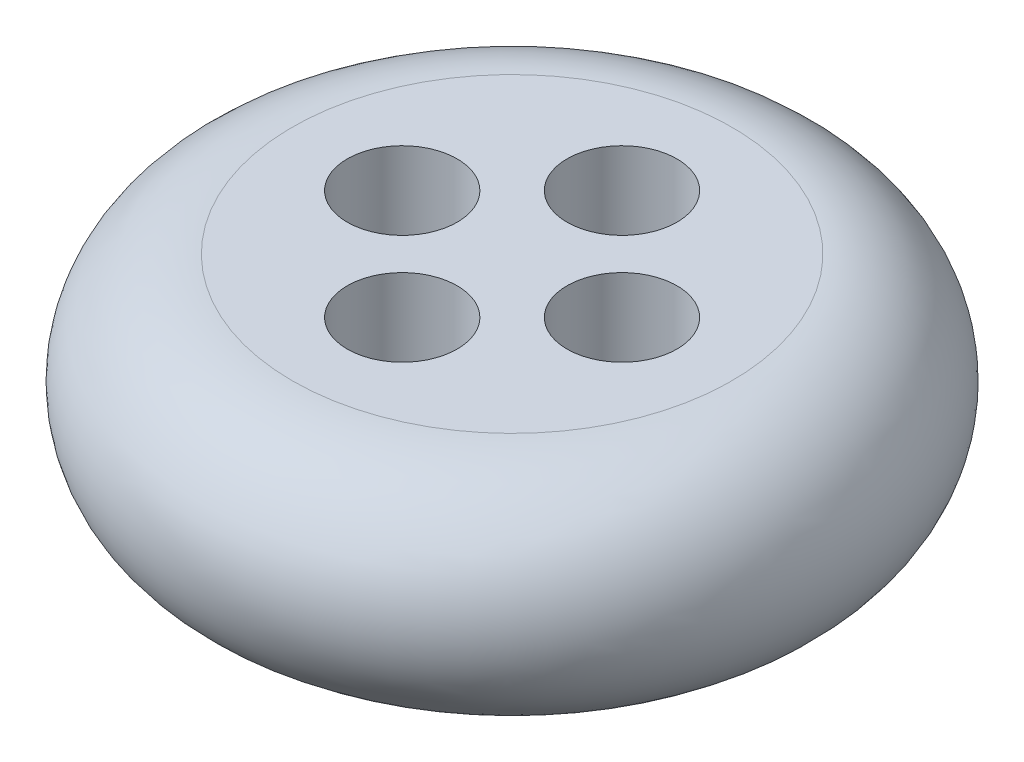
ISO-10303-21;
HEADER;
FILE_DESCRIPTION(('STEP AP214'),'2;1');
FILE_NAME('part.step','',(''),(''),'','','');
FILE_SCHEMA(('AUTOMOTIVE_DESIGN { 1 0 10303 214 1 1 1 1 }'));
ENDSEC;
DATA;
#1=APPLICATION_CONTEXT('core data for automotive mechanical design processes');
#2=APPLICATION_PROTOCOL_DEFINITION('international standard','automotive_design',2000,#1);
#3=PRODUCT_CONTEXT('',#1,'mechanical');
#4=PRODUCT('Part','Part','',(#3));
#5=PRODUCT_RELATED_PRODUCT_CATEGORY('part','',(#4));
#6=PRODUCT_DEFINITION_FORMATION('','',#4);
#7=PRODUCT_DEFINITION_CONTEXT('part definition',#1,'design');
#8=PRODUCT_DEFINITION('design','',#6,#7);
#9=PRODUCT_DEFINITION_SHAPE('','',#8);
#10=(LENGTH_UNIT() NAMED_UNIT(*) SI_UNIT(.MILLI.,.METRE.));
#11=(NAMED_UNIT(*) PLANE_ANGLE_UNIT() SI_UNIT($,.RADIAN.));
#12=(NAMED_UNIT(*) SI_UNIT($,.STERADIAN.) SOLID_ANGLE_UNIT());
#13=UNCERTAINTY_MEASURE_WITH_UNIT(LENGTH_MEASURE(1.E-05),#10,'distance_accuracy_value','');
#14=(GEOMETRIC_REPRESENTATION_CONTEXT(3) GLOBAL_UNCERTAINTY_ASSIGNED_CONTEXT((#13)) GLOBAL_UNIT_ASSIGNED_CONTEXT((#10,
#11,#12)) REPRESENTATION_CONTEXT('',''));
#15=CARTESIAN_POINT('',(0.,0.,0.));
#16=DIRECTION('',(0.,0.,1.));
#17=DIRECTION('',(1.,0.,0.));
#18=AXIS2_PLACEMENT_3D('',#15,#16,#17);
#19=CARTESIAN_POINT('',(0.,5.,0.));
#20=DIRECTION('',(0.,1.,0.));
#21=DIRECTION('',(0.,0.,1.));
#22=AXIS2_PLACEMENT_3D('',#19,#20,#21);
#23=TOROIDAL_SURFACE('',#22,10.,5.);
#24=CARTESIAN_POINT('',(0.,10.,0.));
#25=DIRECTION('',(0.,1.,0.));
#26=DIRECTION('',(0.,0.,1.));
#27=AXIS2_PLACEMENT_3D('',#24,#25,#26);
#28=CIRCLE('',#27,10.);
#29=CARTESIAN_POINT('',(0.,10.,10.));
#30=VERTEX_POINT('',#29);
#31=EDGE_CURVE('E48',#30,#30,#28,.T.);
#32=ORIENTED_EDGE('',*,*,#31,.F.);
#33=EDGE_LOOP('',(#32));
#34=FACE_BOUND('',#33,.T.);
#35=CARTESIAN_POINT('',(0.,0.,0.));
#36=DIRECTION('',(0.,1.,0.));
#37=DIRECTION('',(0.,0.,1.));
#38=AXIS2_PLACEMENT_3D('',#35,#36,#37);
#39=CIRCLE('',#38,10.);
#40=CARTESIAN_POINT('',(0.,0.,10.));
#41=VERTEX_POINT('',#40);
#42=EDGE_CURVE('E10',#41,#41,#39,.F.);
#43=ORIENTED_EDGE('',*,*,#42,.F.);
#44=EDGE_LOOP('',(#43));
#45=FACE_BOUND('',#44,.T.);
#46=ADVANCED_FACE('F41',(#34,#45),#23,.T.);
#47=CARTESIAN_POINT('',(0.,10.,0.));
#48=DIRECTION('',(0.,1.,0.));
#49=DIRECTION('',(0.,0.,1.));
#50=AXIS2_PLACEMENT_3D('',#47,#48,#49);
#51=PLANE('',#50);
#52=ORIENTED_EDGE('',*,*,#31,.T.);
#53=EDGE_LOOP('',(#52));
#54=FACE_BOUND('',#53,.T.);
#55=CARTESIAN_POINT('',(5.,10.,0.));
#56=DIRECTION('',(0.,1.,0.));
#57=DIRECTION('',(0.,0.,1.));
#58=AXIS2_PLACEMENT_3D('',#55,#56,#57);
#59=CIRCLE('',#58,2.5);
#60=CARTESIAN_POINT('',(5.,10.,2.5));
#61=VERTEX_POINT('',#60);
#62=EDGE_CURVE('E65',#61,#61,#59,.T.);
#63=ORIENTED_EDGE('',*,*,#62,.F.);
#64=EDGE_LOOP('',(#63));
#65=FACE_BOUND('',#64,.T.);
#66=CARTESIAN_POINT('',(0.,10.,-5.));
#67=DIRECTION('',(0.,1.,0.));
#68=DIRECTION('',(0.,0.,1.));
#69=AXIS2_PLACEMENT_3D('',#66,#67,#68);
#70=CIRCLE('',#69,2.5);
#71=CARTESIAN_POINT('',(0.,10.,-2.5));
#72=VERTEX_POINT('',#71);
#73=EDGE_CURVE('E52',#72,#72,#70,.T.);
#74=ORIENTED_EDGE('',*,*,#73,.F.);
#75=EDGE_LOOP('',(#74));
#76=FACE_BOUND('',#75,.T.);
#77=CARTESIAN_POINT('',(0.,10.,5.));
#78=DIRECTION('',(0.,1.,0.));
#79=DIRECTION('',(0.,0.,1.));
#80=AXIS2_PLACEMENT_3D('',#77,#78,#79);
#81=CIRCLE('',#80,2.5);
#82=CARTESIAN_POINT('',(0.,10.,7.5));
#83=VERTEX_POINT('',#82);
#84=EDGE_CURVE('E60',#83,#83,#81,.T.);
#85=ORIENTED_EDGE('',*,*,#84,.F.);
#86=EDGE_LOOP('',(#85));
#87=FACE_BOUND('',#86,.T.);
#88=CARTESIAN_POINT('',(-5.,10.,0.));
#89=DIRECTION('',(0.,1.,0.));
#90=DIRECTION('',(0.,0.,1.));
#91=AXIS2_PLACEMENT_3D('',#88,#89,#90);
#92=CIRCLE('',#91,2.5);
#93=CARTESIAN_POINT('',(-5.,10.,2.5));
#94=VERTEX_POINT('',#93);
#95=EDGE_CURVE('E71',#94,#94,#92,.T.);
#96=ORIENTED_EDGE('',*,*,#95,.F.);
#97=EDGE_LOOP('',(#96));
#98=FACE_BOUND('',#97,.T.);
#99=ADVANCED_FACE('F83',(#54,#65,#76,#87,#98),#51,.T.);
#100=CARTESIAN_POINT('',(0.,0.,0.));
#101=DIRECTION('',(0.,1.,0.));
#102=DIRECTION('',(0.,0.,1.));
#103=AXIS2_PLACEMENT_3D('',#100,#101,#102);
#104=PLANE('',#103);
#105=ORIENTED_EDGE('',*,*,#42,.T.);
#106=EDGE_LOOP('',(#105));
#107=FACE_BOUND('',#106,.T.);
#108=CARTESIAN_POINT('',(0.,0.,-5.));
#109=DIRECTION('',(0.,1.,0.));
#110=DIRECTION('',(0.,0.,1.));
#111=AXIS2_PLACEMENT_3D('',#108,#109,#110);
#112=CIRCLE('',#111,2.5);
#113=CARTESIAN_POINT('',(0.,0.,-2.5));
#114=VERTEX_POINT('',#113);
#115=EDGE_CURVE('E56',#114,#114,#112,.T.);
#116=ORIENTED_EDGE('',*,*,#115,.T.);
#117=EDGE_LOOP('',(#116));
#118=FACE_BOUND('',#117,.T.);
#119=CARTESIAN_POINT('',(0.,0.,5.));
#120=DIRECTION('',(0.,1.,0.));
#121=DIRECTION('',(0.,0.,1.));
#122=AXIS2_PLACEMENT_3D('',#119,#120,#121);
#123=CIRCLE('',#122,2.5);
#124=CARTESIAN_POINT('',(0.,0.,7.5));
#125=VERTEX_POINT('',#124);
#126=EDGE_CURVE('E62',#125,#125,#123,.T.);
#127=ORIENTED_EDGE('',*,*,#126,.T.);
#128=EDGE_LOOP('',(#127));
#129=FACE_BOUND('',#128,.T.);
#130=CARTESIAN_POINT('',(5.,0.,0.));
#131=DIRECTION('',(0.,1.,0.));
#132=DIRECTION('',(0.,0.,1.));
#133=AXIS2_PLACEMENT_3D('',#130,#131,#132);
#134=CIRCLE('',#133,2.5);
#135=CARTESIAN_POINT('',(5.,0.,2.5));
#136=VERTEX_POINT('',#135);
#137=EDGE_CURVE('E68',#136,#136,#134,.T.);
#138=ORIENTED_EDGE('',*,*,#137,.T.);
#139=EDGE_LOOP('',(#138));
#140=FACE_BOUND('',#139,.T.);
#141=CARTESIAN_POINT('',(-5.,0.,0.));
#142=DIRECTION('',(0.,1.,0.));
#143=DIRECTION('',(0.,0.,1.));
#144=AXIS2_PLACEMENT_3D('',#141,#142,#143);
#145=CIRCLE('',#144,2.5);
#146=CARTESIAN_POINT('',(-5.,0.,2.5));
#147=VERTEX_POINT('',#146);
#148=EDGE_CURVE('E74',#147,#147,#145,.T.);
#149=ORIENTED_EDGE('',*,*,#148,.T.);
#150=EDGE_LOOP('',(#149));
#151=FACE_BOUND('',#150,.T.);
#152=ADVANCED_FACE('F85',(#107,#118,#129,#140,#151),#104,.F.);
#153=CARTESIAN_POINT('',(0.,10.,-5.));
#154=DIRECTION('',(0.,-1.,0.));
#155=DIRECTION('',(0.,0.,-1.));
#156=AXIS2_PLACEMENT_3D('',#153,#154,#155);
#157=CYLINDRICAL_SURFACE('',#156,2.5);
#158=ORIENTED_EDGE('',*,*,#73,.T.);
#159=EDGE_LOOP('',(#158));
#160=FACE_BOUND('',#159,.T.);
#161=ORIENTED_EDGE('',*,*,#115,.F.);
#162=EDGE_LOOP('',(#161));
#163=FACE_BOUND('',#162,.T.);
#164=ADVANCED_FACE('F91',(#160,#163),#157,.F.);
#165=CARTESIAN_POINT('',(0.,10.,5.));
#166=DIRECTION('',(0.,-1.,0.));
#167=DIRECTION('',(0.,0.,-1.));
#168=AXIS2_PLACEMENT_3D('',#165,#166,#167);
#169=CYLINDRICAL_SURFACE('',#168,2.5);
#170=ORIENTED_EDGE('',*,*,#84,.T.);
#171=EDGE_LOOP('',(#170));
#172=FACE_BOUND('',#171,.T.);
#173=ORIENTED_EDGE('',*,*,#126,.F.);
#174=EDGE_LOOP('',(#173));
#175=FACE_BOUND('',#174,.T.);
#176=ADVANCED_FACE('F97',(#172,#175),#169,.F.);
#177=CARTESIAN_POINT('',(5.,10.,0.));
#178=DIRECTION('',(0.,-1.,0.));
#179=DIRECTION('',(0.,0.,-1.));
#180=AXIS2_PLACEMENT_3D('',#177,#178,#179);
#181=CYLINDRICAL_SURFACE('',#180,2.5);
#182=ORIENTED_EDGE('',*,*,#62,.T.);
#183=EDGE_LOOP('',(#182));
#184=FACE_BOUND('',#183,.T.);
#185=ORIENTED_EDGE('',*,*,#137,.F.);
#186=EDGE_LOOP('',(#185));
#187=FACE_BOUND('',#186,.T.);
#188=ADVANCED_FACE('F101',(#184,#187),#181,.F.);
#189=CARTESIAN_POINT('',(-5.,10.,0.));
#190=DIRECTION('',(0.,-1.,0.));
#191=DIRECTION('',(0.,0.,-1.));
#192=AXIS2_PLACEMENT_3D('',#189,#190,#191);
#193=CYLINDRICAL_SURFACE('',#192,2.5);
#194=ORIENTED_EDGE('',*,*,#95,.T.);
#195=EDGE_LOOP('',(#194));
#196=FACE_BOUND('',#195,.T.);
#197=ORIENTED_EDGE('',*,*,#148,.F.);
#198=EDGE_LOOP('',(#197));
#199=FACE_BOUND('',#198,.T.);
#200=ADVANCED_FACE('F80',(#196,#199),#193,.F.);
#201=CLOSED_SHELL('',(#46,#99,#152,#164,#176,#188,#200));
#202=MANIFOLD_SOLID_BREP('B2',#201);
#203=ADVANCED_BREP_SHAPE_REPRESENTATION('',(#18,#202),#14);
#204=SHAPE_DEFINITION_REPRESENTATION(#9,#203);
ENDSEC;
END-ISO-10303-21;
